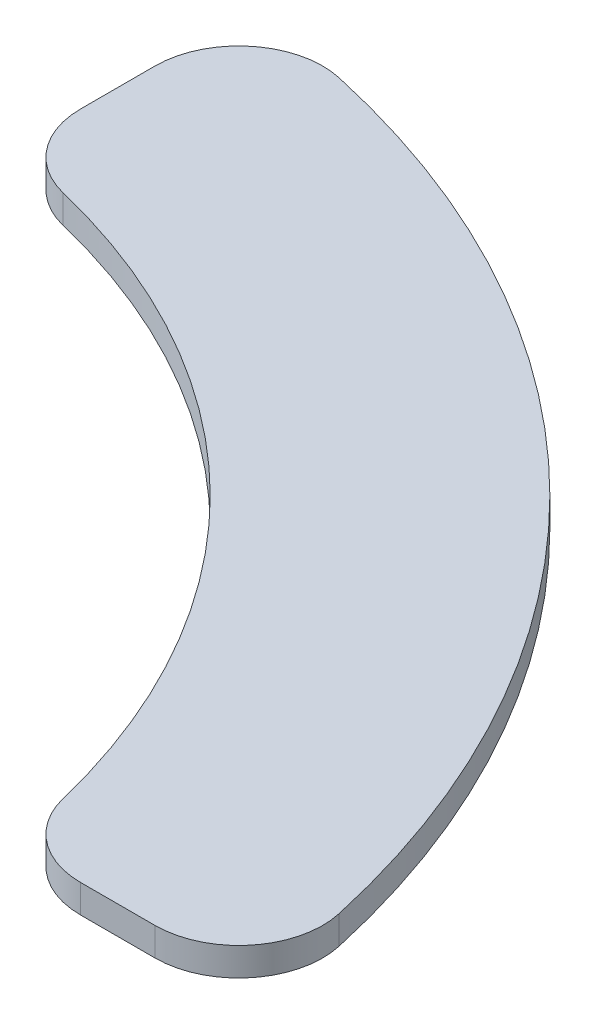
ISO-10303-21;
HEADER;
FILE_DESCRIPTION(('STEP AP214'),'2;1');
FILE_NAME('part.step','',(''),(''),'','','');
FILE_SCHEMA(('AUTOMOTIVE_DESIGN { 1 0 10303 214 1 1 1 1 }'));
ENDSEC;
DATA;
#1=APPLICATION_CONTEXT('core data for automotive mechanical design processes');
#2=APPLICATION_PROTOCOL_DEFINITION('international standard','automotive_design',2000,#1);
#3=PRODUCT_CONTEXT('',#1,'mechanical');
#4=PRODUCT('Part','Part','',(#3));
#5=PRODUCT_RELATED_PRODUCT_CATEGORY('part','',(#4));
#6=PRODUCT_DEFINITION_FORMATION('','',#4);
#7=PRODUCT_DEFINITION_CONTEXT('part definition',#1,'design');
#8=PRODUCT_DEFINITION('design','',#6,#7);
#9=PRODUCT_DEFINITION_SHAPE('','',#8);
#10=(LENGTH_UNIT() NAMED_UNIT(*) SI_UNIT(.MILLI.,.METRE.));
#11=(NAMED_UNIT(*) PLANE_ANGLE_UNIT() SI_UNIT($,.RADIAN.));
#12=(NAMED_UNIT(*) SI_UNIT($,.STERADIAN.) SOLID_ANGLE_UNIT());
#13=UNCERTAINTY_MEASURE_WITH_UNIT(LENGTH_MEASURE(1.E-05),#10,'distance_accuracy_value','');
#14=(GEOMETRIC_REPRESENTATION_CONTEXT(3) GLOBAL_UNCERTAINTY_ASSIGNED_CONTEXT((#13)) GLOBAL_UNIT_ASSIGNED_CONTEXT((#10,
#11,#12)) REPRESENTATION_CONTEXT('',''));
#15=CARTESIAN_POINT('',(0.,0.,0.));
#16=DIRECTION('',(0.,0.,1.));
#17=DIRECTION('',(1.,0.,0.));
#18=AXIS2_PLACEMENT_3D('',#15,#16,#17);
#19=CARTESIAN_POINT('',(116.000000000001,160.051383931985,30.4252614175703));
#20=DIRECTION('',(0.,1.,0.));
#21=DIRECTION('',(0.,0.,1.));
#22=AXIS2_PLACEMENT_3D('',#19,#20,#21);
#23=CYLINDRICAL_SURFACE('',#22,5.78594549028612);
#24=CARTESIAN_POINT('',(116.000000000001,161.999,30.4252614175703));
#25=DIRECTION('',(0.,1.,0.));
#26=DIRECTION('',(0.216666666666678,0.,-0.976245643040496));
#27=AXIS2_PLACEMENT_3D('',#24,#25,#26);
#28=CIRCLE('',#27,5.78594549028612);
#29=CARTESIAN_POINT('',(117.253621522896,161.999,24.7767573418087));
#30=VERTEX_POINT('',#29);
#31=CARTESIAN_POINT('',(110.214054509715,161.999,30.4252614175703));
#32=VERTEX_POINT('',#31);
#33=EDGE_CURVE('E112',#30,#32,#28,.T.);
#34=ORIENTED_EDGE('',*,*,#33,.F.);
#35=DIRECTION('',(0.,1.,0.));
#36=VECTOR('',#35,1.);
#37=CARTESIAN_POINT('',(117.253621522896,160.051383931985,24.7767573418087));
#38=LINE('',#37,#36);
#39=CARTESIAN_POINT('',(117.253621522896,160.051383931985,24.7767573418087));
#40=VERTEX_POINT('',#39);
#41=EDGE_CURVE('E32',#40,#30,#38,.T.);
#42=ORIENTED_EDGE('',*,*,#41,.F.);
#43=CARTESIAN_POINT('',(116.000000000001,160.051383931985,30.4252614175703));
#44=DIRECTION('',(0.,1.,0.));
#45=DIRECTION('',(0.216666666666678,0.,-0.976245643040496));
#46=AXIS2_PLACEMENT_3D('',#43,#44,#45);
#47=CIRCLE('',#46,5.78594549028612);
#48=CARTESIAN_POINT('',(110.214054509715,160.051383931985,30.4252614175703));
#49=VERTEX_POINT('',#48);
#50=EDGE_CURVE('E132',#40,#49,#47,.T.);
#51=ORIENTED_EDGE('',*,*,#50,.T.);
#52=DIRECTION('',(0.,1.,0.));
#53=VECTOR('',#52,1.);
#54=CARTESIAN_POINT('',(110.214054509715,160.051383931985,30.4252614175703));
#55=LINE('',#54,#53);
#56=EDGE_CURVE('E10',#49,#32,#55,.T.);
#57=ORIENTED_EDGE('',*,*,#56,.T.);
#58=EDGE_LOOP('',(#34,#42,#51,#57));
#59=FACE_BOUND('',#58,.T.);
#60=ADVANCED_FACE('F16',(#59),#23,.T.);
#61=CARTESIAN_POINT('',(110.214054509715,160.051383931985,30.4252614175702));
#62=DIRECTION('',(-1.,0.,0.));
#63=DIRECTION('',(0.,0.,1.));
#64=AXIS2_PLACEMENT_3D('',#61,#62,#63);
#65=PLANE('',#64);
#66=DIRECTION('',(0.,0.,1.));
#67=VECTOR('',#66,1.);
#68=CARTESIAN_POINT('',(110.214054509715,161.999,30.4252614175702));
#69=LINE('',#68,#67);
#70=CARTESIAN_POINT('',(110.214054509715,161.999,35.5584431364506));
#71=VERTEX_POINT('',#70);
#72=EDGE_CURVE('E115',#32,#71,#69,.T.);
#73=ORIENTED_EDGE('',*,*,#72,.F.);
#74=ORIENTED_EDGE('',*,*,#56,.F.);
#75=DIRECTION('',(0.,0.,1.));
#76=VECTOR('',#75,1.);
#77=CARTESIAN_POINT('',(110.214054509715,160.051383931985,30.4252614175702));
#78=LINE('',#77,#76);
#79=CARTESIAN_POINT('',(110.214054509715,160.051383931985,35.5584431364506));
#80=VERTEX_POINT('',#79);
#81=EDGE_CURVE('E141',#49,#80,#78,.T.);
#82=ORIENTED_EDGE('',*,*,#81,.T.);
#83=DIRECTION('',(0.,1.,0.));
#84=VECTOR('',#83,1.);
#85=CARTESIAN_POINT('',(110.214054509715,160.051383931985,35.5584431364506));
#86=LINE('',#85,#84);
#87=EDGE_CURVE('E24',#80,#71,#86,.T.);
#88=ORIENTED_EDGE('',*,*,#87,.T.);
#89=EDGE_LOOP('',(#73,#74,#82,#88));
#90=FACE_BOUND('',#89,.T.);
#91=ADVANCED_FACE('F140',(#90),#65,.T.);
#92=CARTESIAN_POINT('',(116.000000000001,160.051383931985,35.5584431364506));
#93=DIRECTION('',(0.,1.,0.));
#94=DIRECTION('',(0.,0.,1.));
#95=AXIS2_PLACEMENT_3D('',#92,#93,#94);
#96=CYLINDRICAL_SURFACE('',#95,5.78594549028612);
#97=CARTESIAN_POINT('',(116.000000000001,161.999,35.5584431364506));
#98=DIRECTION('',(0.,1.,0.));
#99=DIRECTION('',(-1.,0.,0.));
#100=AXIS2_PLACEMENT_3D('',#97,#98,#99);
#101=CIRCLE('',#100,5.78594549028612);
#102=CARTESIAN_POINT('',(114.632412884115,161.999,41.1804419533329));
#103=VERTEX_POINT('',#102);
#104=EDGE_CURVE('E118',#71,#103,#101,.T.);
#105=ORIENTED_EDGE('',*,*,#104,.F.);
#106=ORIENTED_EDGE('',*,*,#87,.F.);
#107=CARTESIAN_POINT('',(116.000000000001,160.051383931985,35.5584431364506));
#108=DIRECTION('',(0.,1.,0.));
#109=DIRECTION('',(-1.,0.,0.));
#110=AXIS2_PLACEMENT_3D('',#107,#108,#109);
#111=CIRCLE('',#110,5.78594549028612);
#112=CARTESIAN_POINT('',(114.632412884115,160.051383931985,41.1804419533329));
#113=VERTEX_POINT('',#112);
#114=EDGE_CURVE('E150',#80,#113,#111,.T.);
#115=ORIENTED_EDGE('',*,*,#114,.T.);
#116=DIRECTION('',(0.,1.,0.));
#117=VECTOR('',#116,1.);
#118=CARTESIAN_POINT('',(114.632412884115,160.051383931985,41.1804419533329));
#119=LINE('',#118,#117);
#120=EDGE_CURVE('E138',#113,#103,#119,.T.);
#121=ORIENTED_EDGE('',*,*,#120,.T.);
#122=EDGE_LOOP('',(#105,#106,#115,#121));
#123=FACE_BOUND('',#122,.T.);
#124=ADVANCED_FACE('F145',(#123),#96,.T.);
#125=CARTESIAN_POINT('',(103.,160.051383931985,89.));
#126=DIRECTION('',(0.,1.,0.));
#127=DIRECTION('',(0.,0.,1.));
#128=AXIS2_PLACEMENT_3D('',#125,#126,#127);
#129=CYLINDRICAL_SURFACE('',#128,49.2140545097139);
#130=CARTESIAN_POINT('',(103.,161.999,89.));
#131=DIRECTION('',(0.,-1.,0.));
#132=DIRECTION('',(0.236363636363649,0.,-0.971664670246352));
#133=AXIS2_PLACEMENT_3D('',#130,#131,#132);
#134=CIRCLE('',#133,49.2140545097139);
#135=CARTESIAN_POINT('',(150.819558046668,161.999,77.3675871158864));
#136=VERTEX_POINT('',#135);
#137=EDGE_CURVE('E121',#103,#136,#134,.T.);
#138=ORIENTED_EDGE('',*,*,#137,.F.);
#139=ORIENTED_EDGE('',*,*,#120,.F.);
#140=CARTESIAN_POINT('',(103.,160.051383931985,89.));
#141=DIRECTION('',(0.,-1.,0.));
#142=DIRECTION('',(0.236363636363649,0.,-0.971664670246352));
#143=AXIS2_PLACEMENT_3D('',#140,#141,#142);
#144=CIRCLE('',#143,49.2140545097139);
#145=CARTESIAN_POINT('',(150.819558046668,160.051383931985,77.3675871158864));
#146=VERTEX_POINT('',#145);
#147=EDGE_CURVE('E154',#113,#146,#144,.T.);
#148=ORIENTED_EDGE('',*,*,#147,.T.);
#149=DIRECTION('',(0.,1.,0.));
#150=VECTOR('',#149,1.);
#151=CARTESIAN_POINT('',(150.819558046668,160.051383931985,77.3675871158864));
#152=LINE('',#151,#150);
#153=EDGE_CURVE('E136',#146,#136,#152,.T.);
#154=ORIENTED_EDGE('',*,*,#153,.T.);
#155=EDGE_LOOP('',(#138,#139,#148,#154));
#156=FACE_BOUND('',#155,.T.);
#157=ADVANCED_FACE('F161',(#156),#129,.F.);
#158=CARTESIAN_POINT('',(156.44155686355,160.051383931985,76.0000000000007));
#159=DIRECTION('',(0.,1.,0.));
#160=DIRECTION('',(0.,0.,1.));
#161=AXIS2_PLACEMENT_3D('',#158,#159,#160);
#162=CYLINDRICAL_SURFACE('',#161,5.78594549028613);
#163=CARTESIAN_POINT('',(156.44155686355,161.999,76.0000000000007));
#164=DIRECTION('',(0.,1.,0.));
#165=DIRECTION('',(-0.971664670246358,0.,0.236363636363625));
#166=AXIS2_PLACEMENT_3D('',#163,#164,#165);
#167=CIRCLE('',#166,5.78594549028613);
#168=CARTESIAN_POINT('',(156.44155686355,161.999,81.7859454902868));
#169=VERTEX_POINT('',#168);
#170=EDGE_CURVE('E124',#136,#169,#167,.T.);
#171=ORIENTED_EDGE('',*,*,#170,.F.);
#172=ORIENTED_EDGE('',*,*,#153,.F.);
#173=CARTESIAN_POINT('',(156.44155686355,160.051383931985,76.0000000000007));
#174=DIRECTION('',(0.,1.,0.));
#175=DIRECTION('',(-0.971664670246358,0.,0.236363636363625));
#176=AXIS2_PLACEMENT_3D('',#173,#174,#175);
#177=CIRCLE('',#176,5.78594549028613);
#178=CARTESIAN_POINT('',(156.44155686355,160.051383931985,81.7859454902868));
#179=VERTEX_POINT('',#178);
#180=EDGE_CURVE('E103',#146,#179,#177,.T.);
#181=ORIENTED_EDGE('',*,*,#180,.T.);
#182=DIRECTION('',(0.,1.,0.));
#183=VECTOR('',#182,1.);
#184=CARTESIAN_POINT('',(156.44155686355,160.051383931985,81.7859454902868));
#185=LINE('',#184,#183);
#186=EDGE_CURVE('E95',#179,#169,#185,.T.);
#187=ORIENTED_EDGE('',*,*,#186,.T.);
#188=EDGE_LOOP('',(#171,#172,#181,#187));
#189=FACE_BOUND('',#188,.T.);
#190=ADVANCED_FACE('F158',(#189),#162,.T.);
#191=CARTESIAN_POINT('',(156.44155686355,160.051383931985,81.7859454902868));
#192=DIRECTION('',(0.,0.,1.));
#193=DIRECTION('',(1.,0.,0.));
#194=AXIS2_PLACEMENT_3D('',#191,#192,#193);
#195=PLANE('',#194);
#196=DIRECTION('',(1.,0.,0.));
#197=VECTOR('',#196,1.);
#198=CARTESIAN_POINT('',(156.44155686355,161.999,81.7859454902868));
#199=LINE('',#198,#197);
#200=CARTESIAN_POINT('',(161.57473858243,161.999,81.7859454902869));
#201=VERTEX_POINT('',#200);
#202=EDGE_CURVE('E127',#169,#201,#199,.T.);
#203=ORIENTED_EDGE('',*,*,#202,.F.);
#204=ORIENTED_EDGE('',*,*,#186,.F.);
#205=DIRECTION('',(1.,0.,0.));
#206=VECTOR('',#205,1.);
#207=CARTESIAN_POINT('',(156.44155686355,160.051383931985,81.7859454902868));
#208=LINE('',#207,#206);
#209=CARTESIAN_POINT('',(161.57473858243,160.051383931985,81.7859454902869));
#210=VERTEX_POINT('',#209);
#211=EDGE_CURVE('E98',#179,#210,#208,.T.);
#212=ORIENTED_EDGE('',*,*,#211,.T.);
#213=DIRECTION('',(0.,1.,0.));
#214=VECTOR('',#213,1.);
#215=CARTESIAN_POINT('',(161.57473858243,160.051383931985,81.7859454902869));
#216=LINE('',#215,#214);
#217=EDGE_CURVE('E84',#210,#201,#216,.T.);
#218=ORIENTED_EDGE('',*,*,#217,.T.);
#219=EDGE_LOOP('',(#203,#204,#212,#218));
#220=FACE_BOUND('',#219,.T.);
#221=ADVANCED_FACE('F99',(#220),#195,.T.);
#222=CARTESIAN_POINT('',(161.57473858243,160.051383931985,76.0000000000008));
#223=DIRECTION('',(0.,1.,0.));
#224=DIRECTION('',(0.,0.,1.));
#225=AXIS2_PLACEMENT_3D('',#222,#223,#224);
#226=CYLINDRICAL_SURFACE('',#225,5.78594549028612);
#227=CARTESIAN_POINT('',(161.57473858243,161.999,76.0000000000008));
#228=DIRECTION('',(0.,1.,0.));
#229=DIRECTION('',(0.,0.,1.));
#230=AXIS2_PLACEMENT_3D('',#227,#228,#229);
#231=CIRCLE('',#230,5.78594549028612);
#232=CARTESIAN_POINT('',(167.223242658192,161.999,74.7463784771055));
#233=VERTEX_POINT('',#232);
#234=EDGE_CURVE('E91',#201,#233,#231,.T.);
#235=ORIENTED_EDGE('',*,*,#234,.F.);
#236=ORIENTED_EDGE('',*,*,#217,.F.);
#237=CARTESIAN_POINT('',(161.57473858243,160.051383931985,76.0000000000008));
#238=DIRECTION('',(0.,1.,0.));
#239=DIRECTION('',(0.,0.,1.));
#240=AXIS2_PLACEMENT_3D('',#237,#238,#239);
#241=CIRCLE('',#240,5.78594549028612);
#242=CARTESIAN_POINT('',(167.223242658192,160.051383931985,74.7463784771055));
#243=VERTEX_POINT('',#242);
#244=EDGE_CURVE('E88',#210,#243,#241,.T.);
#245=ORIENTED_EDGE('',*,*,#244,.T.);
#246=DIRECTION('',(0.,1.,0.));
#247=VECTOR('',#246,1.);
#248=CARTESIAN_POINT('',(167.223242658192,160.051383931985,74.7463784771055));
#249=LINE('',#248,#247);
#250=EDGE_CURVE('E60',#243,#233,#249,.T.);
#251=ORIENTED_EDGE('',*,*,#250,.T.);
#252=EDGE_LOOP('',(#235,#236,#245,#251));
#253=FACE_BOUND('',#252,.T.);
#254=ADVANCED_FACE('F86',(#253),#226,.T.);
#255=CARTESIAN_POINT('',(103.,160.051383931985,89.));
#256=DIRECTION('',(0.,1.,0.));
#257=DIRECTION('',(0.,0.,1.));
#258=AXIS2_PLACEMENT_3D('',#255,#256,#257);
#259=CYLINDRICAL_SURFACE('',#258,65.7859454902861);
#260=CARTESIAN_POINT('',(103.,161.999,89.));
#261=DIRECTION('',(0.,1.,0.));
#262=DIRECTION('',(0.976245643040501,0.,-0.216666666666655));
#263=AXIS2_PLACEMENT_3D('',#260,#261,#262);
#264=CIRCLE('',#263,65.7859454902861);
#265=EDGE_CURVE('E130',#233,#30,#264,.T.);
#266=ORIENTED_EDGE('',*,*,#265,.F.);
#267=ORIENTED_EDGE('',*,*,#250,.F.);
#268=CARTESIAN_POINT('',(103.,160.051383931985,89.));
#269=DIRECTION('',(0.,1.,0.));
#270=DIRECTION('',(0.976245643040501,0.,-0.216666666666655));
#271=AXIS2_PLACEMENT_3D('',#268,#269,#270);
#272=CIRCLE('',#271,65.7859454902861);
#273=EDGE_CURVE('E107',#243,#40,#272,.T.);
#274=ORIENTED_EDGE('',*,*,#273,.T.);
#275=ORIENTED_EDGE('',*,*,#41,.T.);
#276=EDGE_LOOP('',(#266,#267,#274,#275));
#277=FACE_BOUND('',#276,.T.);
#278=ADVANCED_FACE('F217',(#277),#259,.T.);
#279=CARTESIAN_POINT('',(87.9999999999996,160.051383931985,124.457721302983));
#280=DIRECTION('',(0.,1.,0.));
#281=DIRECTION('',(-1.,0.,0.));
#282=AXIS2_PLACEMENT_3D('',#279,#280,#281);
#283=PLANE('',#282);
#284=ORIENTED_EDGE('',*,*,#50,.F.);
#285=ORIENTED_EDGE('',*,*,#273,.F.);
#286=ORIENTED_EDGE('',*,*,#244,.F.);
#287=ORIENTED_EDGE('',*,*,#211,.F.);
#288=ORIENTED_EDGE('',*,*,#180,.F.);
#289=ORIENTED_EDGE('',*,*,#147,.F.);
#290=ORIENTED_EDGE('',*,*,#114,.F.);
#291=ORIENTED_EDGE('',*,*,#81,.F.);
#292=EDGE_LOOP('',(#284,#285,#286,#287,#288,#289,#290,#291));
#293=FACE_BOUND('',#292,.T.);
#294=ADVANCED_FACE('F106',(#293),#283,.F.);
#295=CARTESIAN_POINT('',(87.9999999999996,161.999,124.457721302983));
#296=DIRECTION('',(0.,1.,0.));
#297=DIRECTION('',(-1.,0.,0.));
#298=AXIS2_PLACEMENT_3D('',#295,#296,#297);
#299=PLANE('',#298);
#300=ORIENTED_EDGE('',*,*,#33,.T.);
#301=ORIENTED_EDGE('',*,*,#72,.T.);
#302=ORIENTED_EDGE('',*,*,#104,.T.);
#303=ORIENTED_EDGE('',*,*,#137,.T.);
#304=ORIENTED_EDGE('',*,*,#170,.T.);
#305=ORIENTED_EDGE('',*,*,#202,.T.);
#306=ORIENTED_EDGE('',*,*,#234,.T.);
#307=ORIENTED_EDGE('',*,*,#265,.T.);
#308=EDGE_LOOP('',(#300,#301,#302,#303,#304,#305,#306,#307));
#309=FACE_BOUND('',#308,.T.);
#310=ADVANCED_FACE('F148',(#309),#299,.T.);
#311=CLOSED_SHELL('',(#60,#91,#124,#157,#190,#221,#254,#278,#294,#310));
#312=MANIFOLD_SOLID_BREP('B1',#311);
#313=ADVANCED_BREP_SHAPE_REPRESENTATION('',(#18,#312),#14);
#314=SHAPE_DEFINITION_REPRESENTATION(#9,#313);
ENDSEC;
END-ISO-10303-21;
